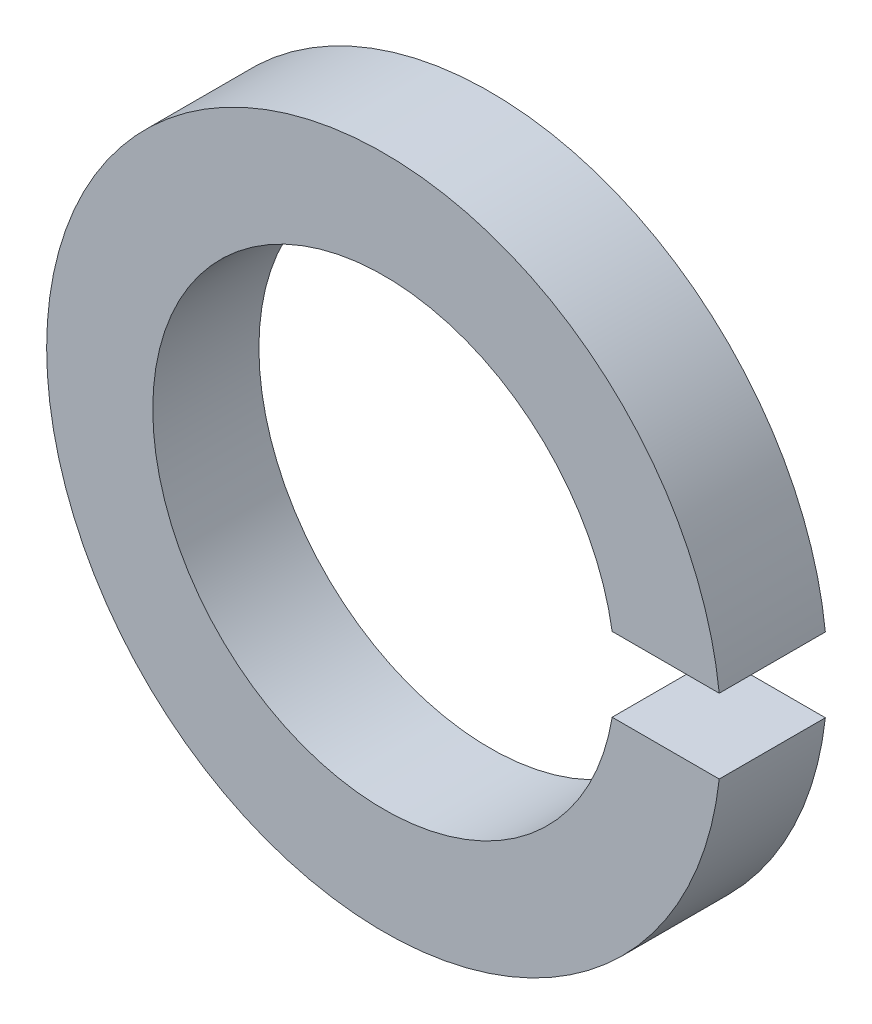
ISO-10303-21;
HEADER;
FILE_DESCRIPTION(('STEP AP214'),'2;1');
FILE_NAME('part.step','',(''),(''),'','','');
FILE_SCHEMA(('AUTOMOTIVE_DESIGN { 1 0 10303 214 1 1 1 1 }'));
ENDSEC;
DATA;
#1=APPLICATION_CONTEXT('core data for automotive mechanical design processes');
#2=APPLICATION_PROTOCOL_DEFINITION('international standard','automotive_design',2000,#1);
#3=PRODUCT_CONTEXT('',#1,'mechanical');
#4=PRODUCT('Part','Part','',(#3));
#5=PRODUCT_RELATED_PRODUCT_CATEGORY('part','',(#4));
#6=PRODUCT_DEFINITION_FORMATION('','',#4);
#7=PRODUCT_DEFINITION_CONTEXT('part definition',#1,'design');
#8=PRODUCT_DEFINITION('design','',#6,#7);
#9=PRODUCT_DEFINITION_SHAPE('','',#8);
#10=(LENGTH_UNIT() NAMED_UNIT(*) SI_UNIT(.MILLI.,.METRE.));
#11=(NAMED_UNIT(*) PLANE_ANGLE_UNIT() SI_UNIT($,.RADIAN.));
#12=(NAMED_UNIT(*) SI_UNIT($,.STERADIAN.) SOLID_ANGLE_UNIT());
#13=UNCERTAINTY_MEASURE_WITH_UNIT(LENGTH_MEASURE(1.E-05),#10,'distance_accuracy_value','');
#14=(GEOMETRIC_REPRESENTATION_CONTEXT(3) GLOBAL_UNCERTAINTY_ASSIGNED_CONTEXT((#13)) GLOBAL_UNIT_ASSIGNED_CONTEXT((#10,
#11,#12)) REPRESENTATION_CONTEXT('',''));
#15=CARTESIAN_POINT('',(0.,0.,0.));
#16=DIRECTION('',(0.,0.,1.));
#17=DIRECTION('',(1.,0.,0.));
#18=AXIS2_PLACEMENT_3D('',#15,#16,#17);
#19=CARTESIAN_POINT('',(0.,0.,1.4));
#20=DIRECTION('',(0.,0.,1.));
#21=DIRECTION('',(1.,0.,0.));
#22=AXIS2_PLACEMENT_3D('',#19,#20,#21);
#23=PLANE('',#22);
#24=DIRECTION('',(-1.,0.,0.));
#25=VECTOR('',#24,1.);
#26=CARTESIAN_POINT('',(2.99548562954673,0.49,1.4));
#27=LINE('',#26,#25);
#28=CARTESIAN_POINT('',(4.42294019855571,0.49,1.4));
#29=VERTEX_POINT('',#28);
#30=CARTESIAN_POINT('',(3.01038203555628,0.49,1.4));
#31=VERTEX_POINT('',#30);
#32=EDGE_CURVE('E50',#29,#31,#27,.T.);
#33=ORIENTED_EDGE('',*,*,#32,.F.);
#34=CARTESIAN_POINT('',(0.,0.,1.4));
#35=DIRECTION('',(0.,0.,1.));
#36=DIRECTION('',(1.,0.,0.));
#37=AXIS2_PLACEMENT_3D('',#34,#35,#36);
#38=CIRCLE('',#37,4.45);
#39=CARTESIAN_POINT('',(4.42294019855571,-0.49,1.4));
#40=VERTEX_POINT('',#39);
#41=EDGE_CURVE('E73',#29,#40,#38,.T.);
#42=ORIENTED_EDGE('',*,*,#41,.T.);
#43=DIRECTION('',(1.,0.,0.));
#44=VECTOR('',#43,1.);
#45=CARTESIAN_POINT('',(2.99548562954673,-0.49,1.4));
#46=LINE('',#45,#44);
#47=CARTESIAN_POINT('',(3.01038203555628,-0.49,1.4));
#48=VERTEX_POINT('',#47);
#49=EDGE_CURVE('E67',#48,#40,#46,.T.);
#50=ORIENTED_EDGE('',*,*,#49,.F.);
#51=CARTESIAN_POINT('',(0.,0.,1.4));
#52=DIRECTION('',(0.,0.,1.));
#53=DIRECTION('',(1.,0.,0.));
#54=AXIS2_PLACEMENT_3D('',#51,#52,#53);
#55=CIRCLE('',#54,3.05);
#56=EDGE_CURVE('E77',#31,#48,#55,.T.);
#57=ORIENTED_EDGE('',*,*,#56,.F.);
#58=EDGE_LOOP('',(#33,#42,#50,#57));
#59=FACE_BOUND('',#58,.T.);
#60=ADVANCED_FACE('F28',(#59),#23,.T.);
#61=CARTESIAN_POINT('',(0.,0.,0.));
#62=DIRECTION('',(0.,0.,1.));
#63=DIRECTION('',(1.,0.,0.));
#64=AXIS2_PLACEMENT_3D('',#61,#62,#63);
#65=PLANE('',#64);
#66=CARTESIAN_POINT('',(0.,0.,0.));
#67=DIRECTION('',(0.,0.,1.));
#68=DIRECTION('',(1.,0.,0.));
#69=AXIS2_PLACEMENT_3D('',#66,#67,#68);
#70=CIRCLE('',#69,4.45);
#71=CARTESIAN_POINT('',(4.42294019855571,0.49,0.));
#72=VERTEX_POINT('',#71);
#73=CARTESIAN_POINT('',(4.42294019855571,-0.49,0.));
#74=VERTEX_POINT('',#73);
#75=EDGE_CURVE('E81',#72,#74,#70,.T.);
#76=ORIENTED_EDGE('',*,*,#75,.F.);
#77=DIRECTION('',(-1.,0.,0.));
#78=VECTOR('',#77,1.);
#79=CARTESIAN_POINT('',(2.99548562954673,0.49,0.));
#80=LINE('',#79,#78);
#81=CARTESIAN_POINT('',(3.01038203555628,0.49,0.));
#82=VERTEX_POINT('',#81);
#83=EDGE_CURVE('E94',#72,#82,#80,.T.);
#84=ORIENTED_EDGE('',*,*,#83,.T.);
#85=CARTESIAN_POINT('',(0.,0.,0.));
#86=DIRECTION('',(0.,0.,1.));
#87=DIRECTION('',(1.,0.,0.));
#88=AXIS2_PLACEMENT_3D('',#85,#86,#87);
#89=CIRCLE('',#88,3.05);
#90=CARTESIAN_POINT('',(3.01038203555628,-0.49,0.));
#91=VERTEX_POINT('',#90);
#92=EDGE_CURVE('E82',#82,#91,#89,.T.);
#93=ORIENTED_EDGE('',*,*,#92,.T.);
#94=DIRECTION('',(1.,0.,0.));
#95=VECTOR('',#94,1.);
#96=CARTESIAN_POINT('',(2.99548562954673,-0.49,0.));
#97=LINE('',#96,#95);
#98=EDGE_CURVE('E43',#91,#74,#97,.T.);
#99=ORIENTED_EDGE('',*,*,#98,.T.);
#100=EDGE_LOOP('',(#76,#84,#93,#99));
#101=FACE_BOUND('',#100,.T.);
#102=ADVANCED_FACE('F100',(#101),#65,.F.);
#103=CARTESIAN_POINT('',(0.,0.,1.4));
#104=DIRECTION('',(0.,0.,-1.));
#105=DIRECTION('',(-1.,0.,0.));
#106=AXIS2_PLACEMENT_3D('',#103,#104,#105);
#107=CYLINDRICAL_SURFACE('',#106,4.45);
#108=ORIENTED_EDGE('',*,*,#41,.F.);
#109=DIRECTION('',(0.,0.,-1.));
#110=VECTOR('',#109,1.);
#111=CARTESIAN_POINT('',(4.42294019855571,0.49,1.4));
#112=LINE('',#111,#110);
#113=EDGE_CURVE('E86',#29,#72,#112,.T.);
#114=ORIENTED_EDGE('',*,*,#113,.T.);
#115=ORIENTED_EDGE('',*,*,#75,.T.);
#116=DIRECTION('',(0.,0.,-1.));
#117=VECTOR('',#116,1.);
#118=CARTESIAN_POINT('',(4.42294019855571,-0.49,1.4));
#119=LINE('',#118,#117);
#120=EDGE_CURVE('E92',#74,#40,#119,.F.);
#121=ORIENTED_EDGE('',*,*,#120,.T.);
#122=EDGE_LOOP('',(#108,#114,#115,#121));
#123=FACE_BOUND('',#122,.T.);
#124=ADVANCED_FACE('F30',(#123),#107,.T.);
#125=CARTESIAN_POINT('',(0.,0.,1.4));
#126=DIRECTION('',(0.,0.,-1.));
#127=DIRECTION('',(-1.,0.,0.));
#128=AXIS2_PLACEMENT_3D('',#125,#126,#127);
#129=CYLINDRICAL_SURFACE('',#128,3.05);
#130=DIRECTION('',(0.,0.,-1.));
#131=VECTOR('',#130,1.);
#132=CARTESIAN_POINT('',(3.01038203555628,0.49,1.4));
#133=LINE('',#132,#131);
#134=EDGE_CURVE('E11',#31,#82,#133,.T.);
#135=ORIENTED_EDGE('',*,*,#134,.F.);
#136=ORIENTED_EDGE('',*,*,#56,.T.);
#137=DIRECTION('',(0.,0.,-1.));
#138=VECTOR('',#137,1.);
#139=CARTESIAN_POINT('',(3.01038203555628,-0.49,1.4));
#140=LINE('',#139,#138);
#141=EDGE_CURVE('E36',#91,#48,#140,.F.);
#142=ORIENTED_EDGE('',*,*,#141,.F.);
#143=ORIENTED_EDGE('',*,*,#92,.F.);
#144=EDGE_LOOP('',(#135,#136,#142,#143));
#145=FACE_BOUND('',#144,.T.);
#146=ADVANCED_FACE('F80',(#145),#129,.F.);
#147=CARTESIAN_POINT('',(2.99548562954673,-0.49,0.));
#148=DIRECTION('',(0.,-1.,0.));
#149=DIRECTION('',(0.,0.,-1.));
#150=AXIS2_PLACEMENT_3D('',#147,#148,#149);
#151=PLANE('',#150);
#152=ORIENTED_EDGE('',*,*,#98,.F.);
#153=ORIENTED_EDGE('',*,*,#141,.T.);
#154=ORIENTED_EDGE('',*,*,#49,.T.);
#155=ORIENTED_EDGE('',*,*,#120,.F.);
#156=EDGE_LOOP('',(#152,#153,#154,#155));
#157=FACE_BOUND('',#156,.T.);
#158=ADVANCED_FACE('F66',(#157),#151,.F.);
#159=CARTESIAN_POINT('',(2.99548562954673,0.49,0.));
#160=DIRECTION('',(0.,1.,0.));
#161=DIRECTION('',(0.,0.,1.));
#162=AXIS2_PLACEMENT_3D('',#159,#160,#161);
#163=PLANE('',#162);
#164=ORIENTED_EDGE('',*,*,#32,.T.);
#165=ORIENTED_EDGE('',*,*,#134,.T.);
#166=ORIENTED_EDGE('',*,*,#83,.F.);
#167=ORIENTED_EDGE('',*,*,#113,.F.);
#168=EDGE_LOOP('',(#164,#165,#166,#167));
#169=FACE_BOUND('',#168,.T.);
#170=ADVANCED_FACE('F102',(#169),#163,.F.);
#171=CLOSED_SHELL('',(#60,#102,#124,#146,#158,#170));
#172=MANIFOLD_SOLID_BREP('B2',#171);
#173=ADVANCED_BREP_SHAPE_REPRESENTATION('',(#18,#172),#14);
#174=SHAPE_DEFINITION_REPRESENTATION(#9,#173);
ENDSEC;
END-ISO-10303-21;
